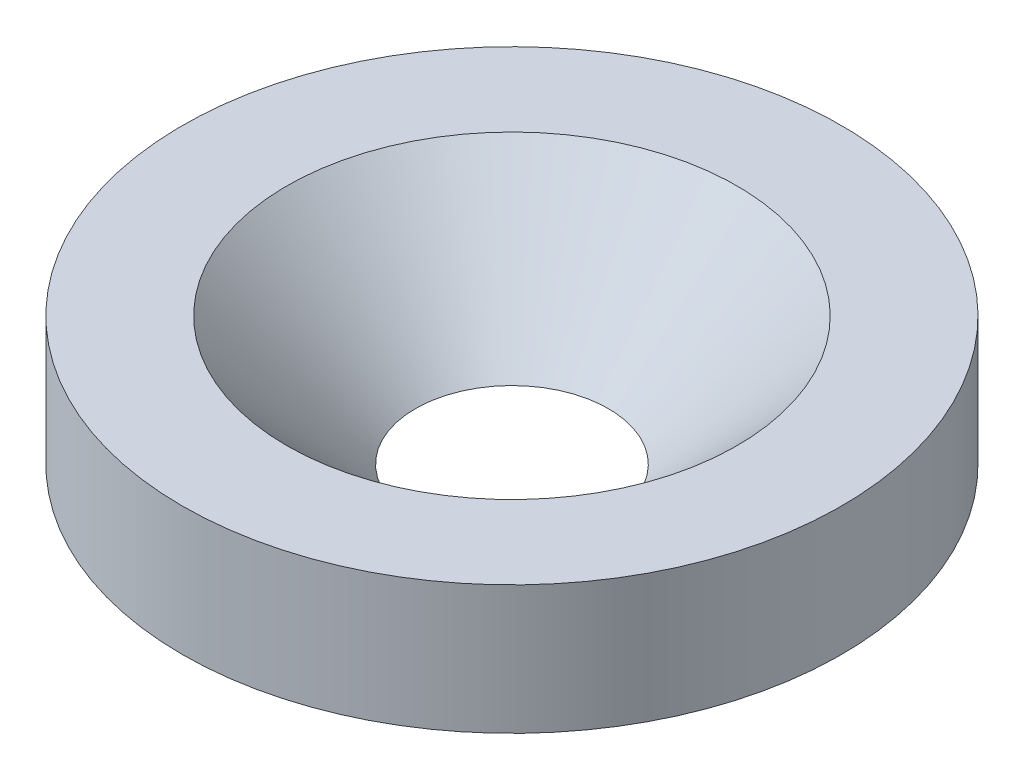
ISO-10303-21;
HEADER;
FILE_DESCRIPTION(('STEP AP214'),'2;1');
FILE_NAME('part.step','',(''),(''),'','','');
FILE_SCHEMA(('AUTOMOTIVE_DESIGN { 1 0 10303 214 1 1 1 1 }'));
ENDSEC;
DATA;
#1=APPLICATION_CONTEXT('core data for automotive mechanical design processes');
#2=APPLICATION_PROTOCOL_DEFINITION('international standard','automotive_design',2000,#1);
#3=PRODUCT_CONTEXT('',#1,'mechanical');
#4=PRODUCT('Part','Part','',(#3));
#5=PRODUCT_RELATED_PRODUCT_CATEGORY('part','',(#4));
#6=PRODUCT_DEFINITION_FORMATION('','',#4);
#7=PRODUCT_DEFINITION_CONTEXT('part definition',#1,'design');
#8=PRODUCT_DEFINITION('design','',#6,#7);
#9=PRODUCT_DEFINITION_SHAPE('','',#8);
#10=(LENGTH_UNIT() NAMED_UNIT(*) SI_UNIT(.MILLI.,.METRE.));
#11=(NAMED_UNIT(*) PLANE_ANGLE_UNIT() SI_UNIT($,.RADIAN.));
#12=(NAMED_UNIT(*) SI_UNIT($,.STERADIAN.) SOLID_ANGLE_UNIT());
#13=UNCERTAINTY_MEASURE_WITH_UNIT(LENGTH_MEASURE(1.E-05),#10,'distance_accuracy_value','');
#14=(GEOMETRIC_REPRESENTATION_CONTEXT(3) GLOBAL_UNCERTAINTY_ASSIGNED_CONTEXT((#13)) GLOBAL_UNIT_ASSIGNED_CONTEXT((#10,
#11,#12)) REPRESENTATION_CONTEXT('',''));
#15=CARTESIAN_POINT('',(0.,0.,0.));
#16=DIRECTION('',(0.,0.,1.));
#17=DIRECTION('',(1.,0.,0.));
#18=AXIS2_PLACEMENT_3D('',#15,#16,#17);
#19=CARTESIAN_POINT('',(0.,8.,0.));
#20=DIRECTION('',(0.,1.,0.));
#21=DIRECTION('',(0.,0.,1.));
#22=AXIS2_PLACEMENT_3D('',#19,#20,#21);
#23=CONICAL_SURFACE('',#22,13.9999999999999,0.785398163397443);
#24=CARTESIAN_POINT('',(0.,0.,0.));
#25=DIRECTION('',(0.,1.,0.));
#26=DIRECTION('',(0.,0.,1.));
#27=AXIS2_PLACEMENT_3D('',#24,#25,#26);
#28=CIRCLE('',#27,6.);
#29=CARTESIAN_POINT('',(0.,0.,6.));
#30=VERTEX_POINT('',#29);
#31=EDGE_CURVE('E49',#30,#30,#28,.T.);
#32=ORIENTED_EDGE('',*,*,#31,.F.);
#33=EDGE_LOOP('',(#32));
#34=FACE_BOUND('',#33,.T.);
#35=CARTESIAN_POINT('',(0.,8.,0.));
#36=DIRECTION('',(0.,1.,0.));
#37=DIRECTION('',(0.,0.,1.));
#38=AXIS2_PLACEMENT_3D('',#35,#36,#37);
#39=CIRCLE('',#38,13.9999999999999);
#40=CARTESIAN_POINT('',(0.,8.,13.9999999999999));
#41=VERTEX_POINT('',#40);
#42=EDGE_CURVE('E10',#41,#41,#39,.T.);
#43=ORIENTED_EDGE('',*,*,#42,.T.);
#44=EDGE_LOOP('',(#43));
#45=FACE_BOUND('',#44,.T.);
#46=ADVANCED_FACE('F35',(#34,#45),#23,.F.);
#47=CARTESIAN_POINT('',(13.9999999999999,8.,0.));
#48=DIRECTION('',(0.,-1.,0.));
#49=DIRECTION('',(0.,0.,-1.));
#50=AXIS2_PLACEMENT_3D('',#47,#48,#49);
#51=PLANE('',#50);
#52=ORIENTED_EDGE('',*,*,#42,.F.);
#53=EDGE_LOOP('',(#52));
#54=FACE_BOUND('',#53,.T.);
#55=CARTESIAN_POINT('',(0.,8.,0.));
#56=DIRECTION('',(0.,1.,0.));
#57=DIRECTION('',(0.,0.,1.));
#58=AXIS2_PLACEMENT_3D('',#55,#56,#57);
#59=CIRCLE('',#58,20.5);
#60=CARTESIAN_POINT('',(0.,8.,20.5));
#61=VERTEX_POINT('',#60);
#62=EDGE_CURVE('E41',#61,#61,#59,.T.);
#63=ORIENTED_EDGE('',*,*,#62,.T.);
#64=EDGE_LOOP('',(#63));
#65=FACE_BOUND('',#64,.T.);
#66=ADVANCED_FACE('F58',(#54,#65),#51,.F.);
#67=CARTESIAN_POINT('',(0.,18.3410194174757,0.));
#68=DIRECTION('',(0.,1.,0.));
#69=DIRECTION('',(0.,0.,1.));
#70=AXIS2_PLACEMENT_3D('',#67,#68,#69);
#71=CYLINDRICAL_SURFACE('',#70,20.5);
#72=ORIENTED_EDGE('',*,*,#62,.F.);
#73=EDGE_LOOP('',(#72));
#74=FACE_BOUND('',#73,.T.);
#75=CARTESIAN_POINT('',(0.,0.,0.));
#76=DIRECTION('',(0.,1.,0.));
#77=DIRECTION('',(0.,0.,1.));
#78=AXIS2_PLACEMENT_3D('',#75,#76,#77);
#79=CIRCLE('',#78,20.5);
#80=CARTESIAN_POINT('',(0.,0.,20.5));
#81=VERTEX_POINT('',#80);
#82=EDGE_CURVE('E45',#81,#81,#79,.T.);
#83=ORIENTED_EDGE('',*,*,#82,.T.);
#84=EDGE_LOOP('',(#83));
#85=FACE_BOUND('',#84,.T.);
#86=ADVANCED_FACE('F62',(#74,#85),#71,.T.);
#87=CARTESIAN_POINT('',(20.5,0.,0.));
#88=DIRECTION('',(0.,1.,0.));
#89=DIRECTION('',(0.,0.,1.));
#90=AXIS2_PLACEMENT_3D('',#87,#88,#89);
#91=PLANE('',#90);
#92=ORIENTED_EDGE('',*,*,#82,.F.);
#93=EDGE_LOOP('',(#92));
#94=FACE_BOUND('',#93,.T.);
#95=ORIENTED_EDGE('',*,*,#31,.T.);
#96=EDGE_LOOP('',(#95));
#97=FACE_BOUND('',#96,.T.);
#98=ADVANCED_FACE('F55',(#94,#97),#91,.F.);
#99=CLOSED_SHELL('',(#46,#66,#86,#98));
#100=MANIFOLD_SOLID_BREP('B2',#99);
#101=ADVANCED_BREP_SHAPE_REPRESENTATION('',(#18,#100),#14);
#102=SHAPE_DEFINITION_REPRESENTATION(#9,#101);
ENDSEC;
END-ISO-10303-21;
